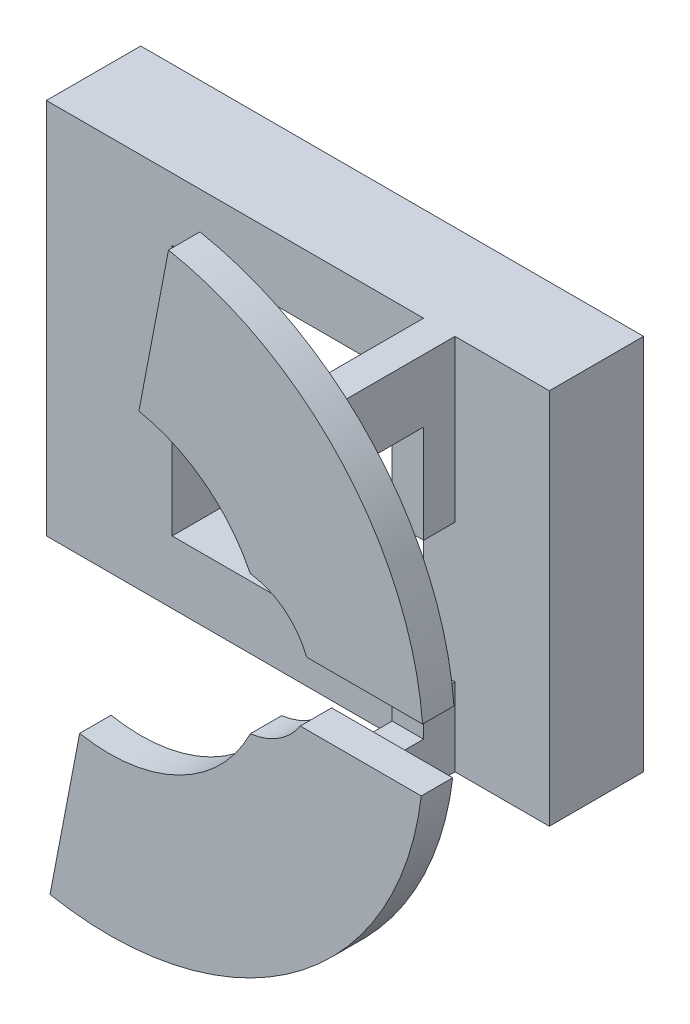
ISO-10303-21;
HEADER;
FILE_DESCRIPTION(('STEP AP214'),'2;1');
FILE_NAME('part.step','',(''),(''),'','','');
FILE_SCHEMA(('AUTOMOTIVE_DESIGN { 1 0 10303 214 1 1 1 1 }'));
ENDSEC;
DATA;
#1=APPLICATION_CONTEXT('core data for automotive mechanical design processes');
#2=APPLICATION_PROTOCOL_DEFINITION('international standard','automotive_design',2000,#1);
#3=PRODUCT_CONTEXT('',#1,'mechanical');
#4=PRODUCT('Part','Part','',(#3));
#5=PRODUCT_RELATED_PRODUCT_CATEGORY('part','',(#4));
#6=PRODUCT_DEFINITION_FORMATION('','',#4);
#7=PRODUCT_DEFINITION_CONTEXT('part definition',#1,'design');
#8=PRODUCT_DEFINITION('design','',#6,#7);
#9=PRODUCT_DEFINITION_SHAPE('','',#8);
#10=(LENGTH_UNIT() NAMED_UNIT(*) SI_UNIT(.MILLI.,.METRE.));
#11=(NAMED_UNIT(*) PLANE_ANGLE_UNIT() SI_UNIT($,.RADIAN.));
#12=(NAMED_UNIT(*) SI_UNIT($,.STERADIAN.) SOLID_ANGLE_UNIT());
#13=UNCERTAINTY_MEASURE_WITH_UNIT(LENGTH_MEASURE(1.E-05),#10,'distance_accuracy_value','');
#14=(GEOMETRIC_REPRESENTATION_CONTEXT(3) GLOBAL_UNCERTAINTY_ASSIGNED_CONTEXT((#13)) GLOBAL_UNIT_ASSIGNED_CONTEXT((#10,
#11,#12)) REPRESENTATION_CONTEXT('',''));
#15=CARTESIAN_POINT('',(0.,0.,0.));
#16=DIRECTION('',(0.,0.,1.));
#17=DIRECTION('',(1.,0.,0.));
#18=AXIS2_PLACEMENT_3D('',#15,#16,#17);
#19=CARTESIAN_POINT('',(0.,0.,20.));
#20=DIRECTION('',(0.,0.,-1.));
#21=DIRECTION('',(-1.,0.,0.));
#22=AXIS2_PLACEMENT_3D('',#19,#20,#21);
#23=PLANE('',#22);
#24=DIRECTION('',(1.,0.,0.));
#25=VECTOR('',#24,1.);
#26=CARTESIAN_POINT('',(20.,20.,20.));
#27=LINE('',#26,#25);
#28=CARTESIAN_POINT('',(20.,20.,20.));
#29=VERTEX_POINT('',#28);
#30=CARTESIAN_POINT('',(25.,20.,20.));
#31=VERTEX_POINT('',#30);
#32=EDGE_CURVE('E55',#29,#31,#27,.T.);
#33=ORIENTED_EDGE('',*,*,#32,.F.);
#34=DIRECTION('',(0.,-1.,0.));
#35=VECTOR('',#34,1.);
#36=CARTESIAN_POINT('',(20.,30.,20.));
#37=LINE('',#36,#35);
#38=CARTESIAN_POINT('',(20.,4.4,20.));
#39=VERTEX_POINT('',#38);
#40=EDGE_CURVE('E342',#29,#39,#37,.T.);
#41=ORIENTED_EDGE('',*,*,#40,.T.);
#42=DIRECTION('',(1.,0.,0.));
#43=VECTOR('',#42,1.);
#44=CARTESIAN_POINT('',(25.,4.4,20.));
#45=LINE('',#44,#43);
#46=CARTESIAN_POINT('',(25.,4.4,20.));
#47=VERTEX_POINT('',#46);
#48=EDGE_CURVE('E345',#39,#47,#45,.T.);
#49=ORIENTED_EDGE('',*,*,#48,.T.);
#50=DIRECTION('',(0.,1.,0.));
#51=VECTOR('',#50,1.);
#52=CARTESIAN_POINT('',(25.,30.,20.));
#53=LINE('',#52,#51);
#54=EDGE_CURVE('E60',#47,#31,#53,.T.);
#55=ORIENTED_EDGE('',*,*,#54,.T.);
#56=EDGE_LOOP('',(#33,#41,#49,#55));
#57=FACE_BOUND('',#56,.T.);
#58=ADVANCED_FACE('F39',(#57),#23,.F.);
#59=CARTESIAN_POINT('',(0.,0.,20.));
#60=DIRECTION('',(0.,0.,1.));
#61=DIRECTION('',(1.,0.,0.));
#62=AXIS2_PLACEMENT_3D('',#59,#60,#61);
#63=PLANE('',#62);
#64=DIRECTION('',(0.,-1.,0.));
#65=VECTOR('',#64,1.);
#66=CARTESIAN_POINT('',(20.,-30.,20.));
#67=LINE('',#66,#65);
#68=CARTESIAN_POINT('',(20.,-17.6,20.));
#69=VERTEX_POINT('',#68);
#70=CARTESIAN_POINT('',(20.,-23.,20.));
#71=VERTEX_POINT('',#70);
#72=EDGE_CURVE('E374',#69,#71,#67,.T.);
#73=ORIENTED_EDGE('',*,*,#72,.T.);
#74=DIRECTION('',(-1.,0.,0.));
#75=VECTOR('',#74,1.);
#76=CARTESIAN_POINT('',(20.,-23.,20.));
#77=LINE('',#76,#75);
#78=CARTESIAN_POINT('',(25.,-23.,20.));
#79=VERTEX_POINT('',#78);
#80=EDGE_CURVE('E321',#79,#71,#77,.T.);
#81=ORIENTED_EDGE('',*,*,#80,.F.);
#82=DIRECTION('',(0.,1.,0.));
#83=VECTOR('',#82,1.);
#84=CARTESIAN_POINT('',(25.,-30.,20.));
#85=LINE('',#84,#83);
#86=CARTESIAN_POINT('',(25.,-17.6,20.));
#87=VERTEX_POINT('',#86);
#88=EDGE_CURVE('E379',#79,#87,#85,.T.);
#89=ORIENTED_EDGE('',*,*,#88,.T.);
#90=DIRECTION('',(-1.,0.,0.));
#91=VECTOR('',#90,1.);
#92=CARTESIAN_POINT('',(25.,-17.6,20.));
#93=LINE('',#92,#91);
#94=EDGE_CURVE('E384',#87,#69,#93,.T.);
#95=ORIENTED_EDGE('',*,*,#94,.T.);
#96=EDGE_LOOP('',(#73,#81,#89,#95));
#97=FACE_BOUND('',#96,.T.);
#98=ADVANCED_FACE('F517',(#97),#63,.T.);
#99=CARTESIAN_POINT('',(0.,0.,15.));
#100=DIRECTION('',(0.,0.,-1.));
#101=DIRECTION('',(-1.,0.,0.));
#102=AXIS2_PLACEMENT_3D('',#99,#100,#101);
#103=PLANE('',#102);
#104=DIRECTION('',(0.,1.,0.));
#105=VECTOR('',#104,1.);
#106=CARTESIAN_POINT('',(25.,30.,15.));
#107=LINE('',#106,#105);
#108=CARTESIAN_POINT('',(25.,4.4,15.));
#109=VERTEX_POINT('',#108);
#110=CARTESIAN_POINT('',(25.,30.,15.));
#111=VERTEX_POINT('',#110);
#112=EDGE_CURVE('E348',#109,#111,#107,.T.);
#113=ORIENTED_EDGE('',*,*,#112,.F.);
#114=DIRECTION('',(1.,0.,0.));
#115=VECTOR('',#114,1.);
#116=CARTESIAN_POINT('',(25.,4.4,15.));
#117=LINE('',#116,#115);
#118=CARTESIAN_POINT('',(20.,4.4,15.));
#119=VERTEX_POINT('',#118);
#120=EDGE_CURVE('E343',#119,#109,#117,.T.);
#121=ORIENTED_EDGE('',*,*,#120,.F.);
#122=DIRECTION('',(0.,1.,0.));
#123=VECTOR('',#122,1.);
#124=CARTESIAN_POINT('',(20.,-20.,15.));
#125=LINE('',#124,#123);
#126=CARTESIAN_POINT('',(20.,-17.6,15.));
#127=VERTEX_POINT('',#126);
#128=EDGE_CURVE('E395',#127,#119,#125,.T.);
#129=ORIENTED_EDGE('',*,*,#128,.F.);
#130=DIRECTION('',(-1.,0.,0.));
#131=VECTOR('',#130,1.);
#132=CARTESIAN_POINT('',(25.,-17.6,15.));
#133=LINE('',#132,#131);
#134=CARTESIAN_POINT('',(25.,-17.6,15.));
#135=VERTEX_POINT('',#134);
#136=EDGE_CURVE('E376',#135,#127,#133,.T.);
#137=ORIENTED_EDGE('',*,*,#136,.F.);
#138=DIRECTION('',(0.,1.,0.));
#139=VECTOR('',#138,1.);
#140=CARTESIAN_POINT('',(25.,-30.,15.));
#141=LINE('',#140,#139);
#142=CARTESIAN_POINT('',(25.,-30.,15.));
#143=VERTEX_POINT('',#142);
#144=EDGE_CURVE('E352',#143,#135,#141,.T.);
#145=ORIENTED_EDGE('',*,*,#144,.F.);
#146=DIRECTION('',(1.,0.,0.));
#147=VECTOR('',#146,1.);
#148=CARTESIAN_POINT('',(40.,-30.,15.));
#149=LINE('',#148,#147);
#150=CARTESIAN_POINT('',(40.,-30.,15.));
#151=VERTEX_POINT('',#150);
#152=EDGE_CURVE('E425',#143,#151,#149,.T.);
#153=ORIENTED_EDGE('',*,*,#152,.T.);
#154=DIRECTION('',(0.,1.,0.));
#155=VECTOR('',#154,1.);
#156=CARTESIAN_POINT('',(40.,-30.,15.));
#157=LINE('',#156,#155);
#158=CARTESIAN_POINT('',(40.,30.,15.));
#159=VERTEX_POINT('',#158);
#160=EDGE_CURVE('E428',#151,#159,#157,.T.);
#161=ORIENTED_EDGE('',*,*,#160,.T.);
#162=DIRECTION('',(-1.,0.,0.));
#163=VECTOR('',#162,1.);
#164=CARTESIAN_POINT('',(40.,30.,15.));
#165=LINE('',#164,#163);
#166=EDGE_CURVE('E419',#159,#111,#165,.T.);
#167=ORIENTED_EDGE('',*,*,#166,.T.);
#168=EDGE_LOOP('',(#113,#121,#129,#137,#145,#153,#161,#167));
#169=FACE_BOUND('',#168,.T.);
#170=ADVANCED_FACE('F471',(#169),#103,.F.);
#171=DIRECTION('',(0.,-1.,0.));
#172=VECTOR('',#171,1.);
#173=CARTESIAN_POINT('',(20.,30.,15.));
#174=LINE('',#173,#172);
#175=CARTESIAN_POINT('',(20.,30.,15.));
#176=VERTEX_POINT('',#175);
#177=CARTESIAN_POINT('',(20.,20.,15.));
#178=VERTEX_POINT('',#177);
#179=EDGE_CURVE('E351',#176,#178,#174,.T.);
#180=ORIENTED_EDGE('',*,*,#179,.F.);
#181=CARTESIAN_POINT('',(-40.,30.,15.));
#182=VERTEX_POINT('',#181);
#183=EDGE_CURVE('E423',#176,#182,#165,.T.);
#184=ORIENTED_EDGE('',*,*,#183,.T.);
#185=DIRECTION('',(0.,-1.,0.));
#186=VECTOR('',#185,1.);
#187=CARTESIAN_POINT('',(-40.,-30.,15.));
#188=LINE('',#187,#186);
#189=CARTESIAN_POINT('',(-40.,-30.,15.));
#190=VERTEX_POINT('',#189);
#191=EDGE_CURVE('E422',#182,#190,#188,.T.);
#192=ORIENTED_EDGE('',*,*,#191,.T.);
#193=CARTESIAN_POINT('',(20.,-30.,15.));
#194=VERTEX_POINT('',#193);
#195=EDGE_CURVE('E426',#190,#194,#149,.T.);
#196=ORIENTED_EDGE('',*,*,#195,.T.);
#197=DIRECTION('',(0.,-1.,0.));
#198=VECTOR('',#197,1.);
#199=CARTESIAN_POINT('',(20.,-30.,15.));
#200=LINE('',#199,#198);
#201=CARTESIAN_POINT('',(20.,-20.,15.));
#202=VERTEX_POINT('',#201);
#203=EDGE_CURVE('E11',#202,#194,#200,.T.);
#204=ORIENTED_EDGE('',*,*,#203,.F.);
#205=DIRECTION('',(1.,0.,0.));
#206=VECTOR('',#205,1.);
#207=CARTESIAN_POINT('',(-20.,-20.,15.));
#208=LINE('',#207,#206);
#209=CARTESIAN_POINT('',(-20.,-20.,15.));
#210=VERTEX_POINT('',#209);
#211=EDGE_CURVE('E392',#210,#202,#208,.T.);
#212=ORIENTED_EDGE('',*,*,#211,.F.);
#213=DIRECTION('',(0.,-1.,0.));
#214=VECTOR('',#213,1.);
#215=CARTESIAN_POINT('',(-20.,-20.,15.));
#216=LINE('',#215,#214);
#217=CARTESIAN_POINT('',(-20.,20.,15.));
#218=VERTEX_POINT('',#217);
#219=EDGE_CURVE('E389',#218,#210,#216,.T.);
#220=ORIENTED_EDGE('',*,*,#219,.F.);
#221=DIRECTION('',(-1.,0.,0.));
#222=VECTOR('',#221,1.);
#223=CARTESIAN_POINT('',(-20.,20.,15.));
#224=LINE('',#223,#222);
#225=EDGE_CURVE('E387',#178,#218,#224,.T.);
#226=ORIENTED_EDGE('',*,*,#225,.F.);
#227=EDGE_LOOP('',(#180,#184,#192,#196,#204,#212,#220,#226));
#228=FACE_BOUND('',#227,.T.);
#229=ADVANCED_FACE('F489',(#228),#103,.F.);
#230=CARTESIAN_POINT('',(0.,0.,0.));
#231=DIRECTION('',(0.,0.,-1.));
#232=DIRECTION('',(-1.,0.,0.));
#233=AXIS2_PLACEMENT_3D('',#230,#231,#232);
#234=PLANE('',#233);
#235=DIRECTION('',(-1.,0.,0.));
#236=VECTOR('',#235,1.);
#237=CARTESIAN_POINT('',(40.,30.,0.));
#238=LINE('',#237,#236);
#239=CARTESIAN_POINT('',(40.,30.,0.));
#240=VERTEX_POINT('',#239);
#241=CARTESIAN_POINT('',(-40.,30.,0.));
#242=VERTEX_POINT('',#241);
#243=EDGE_CURVE('E418',#240,#242,#238,.T.);
#244=ORIENTED_EDGE('',*,*,#243,.F.);
#245=DIRECTION('',(0.,1.,0.));
#246=VECTOR('',#245,1.);
#247=CARTESIAN_POINT('',(40.,-30.,0.));
#248=LINE('',#247,#246);
#249=CARTESIAN_POINT('',(40.,-30.,0.));
#250=VERTEX_POINT('',#249);
#251=EDGE_CURVE('E437',#250,#240,#248,.T.);
#252=ORIENTED_EDGE('',*,*,#251,.F.);
#253=DIRECTION('',(1.,0.,0.));
#254=VECTOR('',#253,1.);
#255=CARTESIAN_POINT('',(40.,-30.,0.));
#256=LINE('',#255,#254);
#257=CARTESIAN_POINT('',(-40.,-30.,0.));
#258=VERTEX_POINT('',#257);
#259=EDGE_CURVE('E435',#258,#250,#256,.T.);
#260=ORIENTED_EDGE('',*,*,#259,.F.);
#261=DIRECTION('',(0.,-1.,0.));
#262=VECTOR('',#261,1.);
#263=CARTESIAN_POINT('',(-40.,-30.,0.));
#264=LINE('',#263,#262);
#265=EDGE_CURVE('E433',#242,#258,#264,.T.);
#266=ORIENTED_EDGE('',*,*,#265,.F.);
#267=EDGE_LOOP('',(#244,#252,#260,#266));
#268=FACE_BOUND('',#267,.T.);
#269=DIRECTION('',(0.,1.,0.));
#270=VECTOR('',#269,1.);
#271=CARTESIAN_POINT('',(20.,-20.,0.));
#272=LINE('',#271,#270);
#273=CARTESIAN_POINT('',(20.,-20.,0.));
#274=VERTEX_POINT('',#273);
#275=CARTESIAN_POINT('',(20.,20.,0.));
#276=VERTEX_POINT('',#275);
#277=EDGE_CURVE('E390',#274,#276,#272,.T.);
#278=ORIENTED_EDGE('',*,*,#277,.T.);
#279=DIRECTION('',(-1.,0.,0.));
#280=VECTOR('',#279,1.);
#281=CARTESIAN_POINT('',(-20.,20.,0.));
#282=LINE('',#281,#280);
#283=CARTESIAN_POINT('',(-20.,20.,0.));
#284=VERTEX_POINT('',#283);
#285=EDGE_CURVE('E363',#276,#284,#282,.T.);
#286=ORIENTED_EDGE('',*,*,#285,.T.);
#287=DIRECTION('',(0.,-1.,0.));
#288=VECTOR('',#287,1.);
#289=CARTESIAN_POINT('',(-20.,-20.,0.));
#290=LINE('',#289,#288);
#291=CARTESIAN_POINT('',(-20.,-20.,0.));
#292=VERTEX_POINT('',#291);
#293=EDGE_CURVE('E401',#284,#292,#290,.T.);
#294=ORIENTED_EDGE('',*,*,#293,.T.);
#295=DIRECTION('',(1.,0.,0.));
#296=VECTOR('',#295,1.);
#297=CARTESIAN_POINT('',(-20.,-20.,0.));
#298=LINE('',#297,#296);
#299=EDGE_CURVE('E404',#292,#274,#298,.T.);
#300=ORIENTED_EDGE('',*,*,#299,.T.);
#301=EDGE_LOOP('',(#278,#286,#294,#300));
#302=FACE_BOUND('',#301,.T.);
#303=ADVANCED_FACE('F461',(#268,#302),#234,.T.);
#304=CARTESIAN_POINT('',(40.,30.,15.));
#305=DIRECTION('',(0.,-1.,0.));
#306=DIRECTION('',(0.,0.,-1.));
#307=AXIS2_PLACEMENT_3D('',#304,#305,#306);
#308=PLANE('',#307);
#309=ORIENTED_EDGE('',*,*,#243,.T.);
#310=DIRECTION('',(0.,0.,-1.));
#311=VECTOR('',#310,1.);
#312=CARTESIAN_POINT('',(-40.,30.,15.));
#313=LINE('',#312,#311);
#314=EDGE_CURVE('E43',#182,#242,#313,.T.);
#315=ORIENTED_EDGE('',*,*,#314,.F.);
#316=ORIENTED_EDGE('',*,*,#183,.F.);
#317=DIRECTION('',(0.,0.,-1.));
#318=VECTOR('',#317,1.);
#319=CARTESIAN_POINT('',(20.,30.,20.));
#320=LINE('',#319,#318);
#321=CARTESIAN_POINT('',(20.,30.,40.));
#322=VERTEX_POINT('',#321);
#323=EDGE_CURVE('E359',#322,#176,#320,.T.);
#324=ORIENTED_EDGE('',*,*,#323,.F.);
#325=DIRECTION('',(-1.,0.,0.));
#326=VECTOR('',#325,1.);
#327=CARTESIAN_POINT('',(20.,30.,40.));
#328=LINE('',#327,#326);
#329=CARTESIAN_POINT('',(25.,30.,40.));
#330=VERTEX_POINT('',#329);
#331=EDGE_CURVE('E312',#330,#322,#328,.T.);
#332=ORIENTED_EDGE('',*,*,#331,.F.);
#333=DIRECTION('',(0.,0.,-1.));
#334=VECTOR('',#333,1.);
#335=CARTESIAN_POINT('',(25.,30.,20.));
#336=LINE('',#335,#334);
#337=EDGE_CURVE('E361',#330,#111,#336,.T.);
#338=ORIENTED_EDGE('',*,*,#337,.T.);
#339=ORIENTED_EDGE('',*,*,#166,.F.);
#340=DIRECTION('',(0.,0.,-1.));
#341=VECTOR('',#340,1.);
#342=CARTESIAN_POINT('',(40.,30.,15.));
#343=LINE('',#342,#341);
#344=EDGE_CURVE('E430',#159,#240,#343,.T.);
#345=ORIENTED_EDGE('',*,*,#344,.T.);
#346=EDGE_LOOP('',(#309,#315,#316,#324,#332,#338,#339,#345));
#347=FACE_BOUND('',#346,.T.);
#348=ADVANCED_FACE('F41',(#347),#308,.F.);
#349=CARTESIAN_POINT('',(-40.,-30.,15.));
#350=DIRECTION('',(1.,0.,0.));
#351=DIRECTION('',(0.,0.,-1.));
#352=AXIS2_PLACEMENT_3D('',#349,#350,#351);
#353=PLANE('',#352);
#354=ORIENTED_EDGE('',*,*,#265,.T.);
#355=DIRECTION('',(0.,0.,-1.));
#356=VECTOR('',#355,1.);
#357=CARTESIAN_POINT('',(-40.,-30.,15.));
#358=LINE('',#357,#356);
#359=EDGE_CURVE('E443',#190,#258,#358,.T.);
#360=ORIENTED_EDGE('',*,*,#359,.F.);
#361=ORIENTED_EDGE('',*,*,#191,.F.);
#362=ORIENTED_EDGE('',*,*,#314,.T.);
#363=EDGE_LOOP('',(#354,#360,#361,#362));
#364=FACE_BOUND('',#363,.T.);
#365=ADVANCED_FACE('F453',(#364),#353,.F.);
#366=CARTESIAN_POINT('',(40.,-30.,15.));
#367=DIRECTION('',(0.,1.,0.));
#368=DIRECTION('',(0.,0.,1.));
#369=AXIS2_PLACEMENT_3D('',#366,#367,#368);
#370=PLANE('',#369);
#371=ORIENTED_EDGE('',*,*,#259,.T.);
#372=DIRECTION('',(0.,0.,-1.));
#373=VECTOR('',#372,1.);
#374=CARTESIAN_POINT('',(40.,-30.,15.));
#375=LINE('',#374,#373);
#376=EDGE_CURVE('E441',#151,#250,#375,.T.);
#377=ORIENTED_EDGE('',*,*,#376,.F.);
#378=ORIENTED_EDGE('',*,*,#152,.F.);
#379=DIRECTION('',(0.,0.,-1.));
#380=VECTOR('',#379,1.);
#381=CARTESIAN_POINT('',(25.,-30.,20.));
#382=LINE('',#381,#380);
#383=CARTESIAN_POINT('',(25.,-30.,40.));
#384=VERTEX_POINT('',#383);
#385=EDGE_CURVE('E372',#384,#143,#382,.T.);
#386=ORIENTED_EDGE('',*,*,#385,.F.);
#387=DIRECTION('',(1.,0.,0.));
#388=VECTOR('',#387,1.);
#389=CARTESIAN_POINT('',(20.,-30.,40.));
#390=LINE('',#389,#388);
#391=CARTESIAN_POINT('',(20.,-30.,40.));
#392=VERTEX_POINT('',#391);
#393=EDGE_CURVE('E325',#392,#384,#390,.T.);
#394=ORIENTED_EDGE('',*,*,#393,.F.);
#395=DIRECTION('',(0.,0.,-1.));
#396=VECTOR('',#395,1.);
#397=CARTESIAN_POINT('',(20.,-30.,20.));
#398=LINE('',#397,#396);
#399=EDGE_CURVE('E369',#392,#194,#398,.T.);
#400=ORIENTED_EDGE('',*,*,#399,.T.);
#401=ORIENTED_EDGE('',*,*,#195,.F.);
#402=ORIENTED_EDGE('',*,*,#359,.T.);
#403=EDGE_LOOP('',(#371,#377,#378,#386,#394,#400,#401,#402));
#404=FACE_BOUND('',#403,.T.);
#405=ADVANCED_FACE('F464',(#404),#370,.F.);
#406=CARTESIAN_POINT('',(40.,-30.,15.));
#407=DIRECTION('',(-1.,0.,0.));
#408=DIRECTION('',(0.,0.,1.));
#409=AXIS2_PLACEMENT_3D('',#406,#407,#408);
#410=PLANE('',#409);
#411=ORIENTED_EDGE('',*,*,#251,.T.);
#412=ORIENTED_EDGE('',*,*,#344,.F.);
#413=ORIENTED_EDGE('',*,*,#160,.F.);
#414=ORIENTED_EDGE('',*,*,#376,.T.);
#415=EDGE_LOOP('',(#411,#412,#413,#414));
#416=FACE_BOUND('',#415,.T.);
#417=ADVANCED_FACE('F468',(#416),#410,.F.);
#418=CARTESIAN_POINT('',(-20.,20.,15.));
#419=DIRECTION('',(0.,-1.,0.));
#420=DIRECTION('',(0.,0.,-1.));
#421=AXIS2_PLACEMENT_3D('',#418,#419,#420);
#422=PLANE('',#421);
#423=ORIENTED_EDGE('',*,*,#285,.F.);
#424=DIRECTION('',(0.,0.,-1.));
#425=VECTOR('',#424,1.);
#426=CARTESIAN_POINT('',(20.,20.,15.));
#427=LINE('',#426,#425);
#428=EDGE_CURVE('E398',#178,#276,#427,.T.);
#429=ORIENTED_EDGE('',*,*,#428,.F.);
#430=ORIENTED_EDGE('',*,*,#225,.T.);
#431=DIRECTION('',(0.,0.,-1.));
#432=VECTOR('',#431,1.);
#433=CARTESIAN_POINT('',(-20.,20.,15.));
#434=LINE('',#433,#432);
#435=EDGE_CURVE('E415',#218,#284,#434,.T.);
#436=ORIENTED_EDGE('',*,*,#435,.T.);
#437=EDGE_LOOP('',(#423,#429,#430,#436));
#438=FACE_BOUND('',#437,.T.);
#439=ADVANCED_FACE('F546',(#438),#422,.T.);
#440=CARTESIAN_POINT('',(-20.,-20.,15.));
#441=DIRECTION('',(1.,0.,0.));
#442=DIRECTION('',(0.,0.,-1.));
#443=AXIS2_PLACEMENT_3D('',#440,#441,#442);
#444=PLANE('',#443);
#445=ORIENTED_EDGE('',*,*,#293,.F.);
#446=ORIENTED_EDGE('',*,*,#435,.F.);
#447=ORIENTED_EDGE('',*,*,#219,.T.);
#448=DIRECTION('',(0.,0.,-1.));
#449=VECTOR('',#448,1.);
#450=CARTESIAN_POINT('',(-20.,-20.,15.));
#451=LINE('',#450,#449);
#452=EDGE_CURVE('E413',#210,#292,#451,.T.);
#453=ORIENTED_EDGE('',*,*,#452,.T.);
#454=EDGE_LOOP('',(#445,#446,#447,#453));
#455=FACE_BOUND('',#454,.T.);
#456=ADVANCED_FACE('F542',(#455),#444,.T.);
#457=CARTESIAN_POINT('',(-20.,-20.,15.));
#458=DIRECTION('',(0.,1.,0.));
#459=DIRECTION('',(0.,0.,1.));
#460=AXIS2_PLACEMENT_3D('',#457,#458,#459);
#461=PLANE('',#460);
#462=ORIENTED_EDGE('',*,*,#299,.F.);
#463=ORIENTED_EDGE('',*,*,#452,.F.);
#464=ORIENTED_EDGE('',*,*,#211,.T.);
#465=DIRECTION('',(0.,0.,-1.));
#466=VECTOR('',#465,1.);
#467=CARTESIAN_POINT('',(20.,-20.,15.));
#468=LINE('',#467,#466);
#469=EDGE_CURVE('E411',#202,#274,#468,.T.);
#470=ORIENTED_EDGE('',*,*,#469,.T.);
#471=EDGE_LOOP('',(#462,#463,#464,#470));
#472=FACE_BOUND('',#471,.T.);
#473=ADVANCED_FACE('F539',(#472),#461,.T.);
#474=CARTESIAN_POINT('',(20.,-20.,15.));
#475=DIRECTION('',(-1.,0.,0.));
#476=DIRECTION('',(0.,0.,1.));
#477=AXIS2_PLACEMENT_3D('',#474,#475,#476);
#478=PLANE('',#477);
#479=ORIENTED_EDGE('',*,*,#277,.F.);
#480=ORIENTED_EDGE('',*,*,#469,.F.);
#481=ORIENTED_EDGE('',*,*,#203,.T.);
#482=ORIENTED_EDGE('',*,*,#399,.F.);
#483=DIRECTION('',(0.,-1.,0.));
#484=VECTOR('',#483,1.);
#485=CARTESIAN_POINT('',(20.,-30.,40.));
#486=LINE('',#485,#484);
#487=CARTESIAN_POINT('',(20.,-23.,40.));
#488=VERTEX_POINT('',#487);
#489=EDGE_CURVE('E322',#488,#392,#486,.T.);
#490=ORIENTED_EDGE('',*,*,#489,.F.);
#491=DIRECTION('',(0.,0.,-1.));
#492=VECTOR('',#491,1.);
#493=CARTESIAN_POINT('',(20.,-23.,40.));
#494=LINE('',#493,#492);
#495=EDGE_CURVE('E334',#488,#71,#494,.T.);
#496=ORIENTED_EDGE('',*,*,#495,.T.);
#497=ORIENTED_EDGE('',*,*,#72,.F.);
#498=DIRECTION('',(0.,0.,-1.));
#499=VECTOR('',#498,1.);
#500=CARTESIAN_POINT('',(20.,-17.6,20.));
#501=LINE('',#500,#499);
#502=EDGE_CURVE('E366',#69,#127,#501,.T.);
#503=ORIENTED_EDGE('',*,*,#502,.T.);
#504=ORIENTED_EDGE('',*,*,#128,.T.);
#505=DIRECTION('',(0.,0.,-1.));
#506=VECTOR('',#505,1.);
#507=CARTESIAN_POINT('',(20.,4.4,20.));
#508=LINE('',#507,#506);
#509=EDGE_CURVE('E357',#39,#119,#508,.T.);
#510=ORIENTED_EDGE('',*,*,#509,.F.);
#511=ORIENTED_EDGE('',*,*,#40,.F.);
#512=DIRECTION('',(0.,0.,-1.));
#513=VECTOR('',#512,1.);
#514=CARTESIAN_POINT('',(20.,20.,40.));
#515=LINE('',#514,#513);
#516=CARTESIAN_POINT('',(20.,20.,40.));
#517=VERTEX_POINT('',#516);
#518=EDGE_CURVE('E318',#517,#29,#515,.T.);
#519=ORIENTED_EDGE('',*,*,#518,.F.);
#520=DIRECTION('',(0.,-1.,0.));
#521=VECTOR('',#520,1.);
#522=CARTESIAN_POINT('',(20.,30.,40.));
#523=LINE('',#522,#521);
#524=EDGE_CURVE('E261',#322,#517,#523,.T.);
#525=ORIENTED_EDGE('',*,*,#524,.F.);
#526=ORIENTED_EDGE('',*,*,#323,.T.);
#527=ORIENTED_EDGE('',*,*,#179,.T.);
#528=ORIENTED_EDGE('',*,*,#428,.T.);
#529=EDGE_LOOP('',(#479,#480,#481,#482,#490,#496,#497,#503,#504,#510,#511,#519,#525,#526,#527,#528));
#530=FACE_BOUND('',#529,.T.);
#531=ADVANCED_FACE('F483',(#530),#478,.T.);
#532=CARTESIAN_POINT('',(25.,-30.,20.));
#533=DIRECTION('',(-1.,0.,0.));
#534=DIRECTION('',(0.,0.,1.));
#535=AXIS2_PLACEMENT_3D('',#532,#533,#534);
#536=PLANE('',#535);
#537=ORIENTED_EDGE('',*,*,#144,.T.);
#538=DIRECTION('',(0.,0.,-1.));
#539=VECTOR('',#538,1.);
#540=CARTESIAN_POINT('',(25.,-17.6,20.));
#541=LINE('',#540,#539);
#542=EDGE_CURVE('E340',#87,#135,#541,.T.);
#543=ORIENTED_EDGE('',*,*,#542,.F.);
#544=ORIENTED_EDGE('',*,*,#88,.F.);
#545=DIRECTION('',(0.,0.,-1.));
#546=VECTOR('',#545,1.);
#547=CARTESIAN_POINT('',(25.,-23.,40.));
#548=LINE('',#547,#546);
#549=CARTESIAN_POINT('',(25.,-23.,40.));
#550=VERTEX_POINT('',#549);
#551=EDGE_CURVE('E338',#550,#79,#548,.T.);
#552=ORIENTED_EDGE('',*,*,#551,.F.);
#553=DIRECTION('',(0.,1.,0.));
#554=VECTOR('',#553,1.);
#555=CARTESIAN_POINT('',(25.,-30.,40.));
#556=LINE('',#555,#554);
#557=EDGE_CURVE('E328',#384,#550,#556,.T.);
#558=ORIENTED_EDGE('',*,*,#557,.F.);
#559=ORIENTED_EDGE('',*,*,#385,.T.);
#560=EDGE_LOOP('',(#537,#543,#544,#552,#558,#559));
#561=FACE_BOUND('',#560,.T.);
#562=ADVANCED_FACE('F475',(#561),#536,.F.);
#563=CARTESIAN_POINT('',(25.,-17.6,20.));
#564=DIRECTION('',(0.,-1.,0.));
#565=DIRECTION('',(0.,0.,-1.));
#566=AXIS2_PLACEMENT_3D('',#563,#564,#565);
#567=PLANE('',#566);
#568=ORIENTED_EDGE('',*,*,#136,.T.);
#569=ORIENTED_EDGE('',*,*,#502,.F.);
#570=ORIENTED_EDGE('',*,*,#94,.F.);
#571=ORIENTED_EDGE('',*,*,#542,.T.);
#572=EDGE_LOOP('',(#568,#569,#570,#571));
#573=FACE_BOUND('',#572,.T.);
#574=ADVANCED_FACE('F531',(#573),#567,.F.);
#575=CARTESIAN_POINT('',(25.,30.,20.));
#576=DIRECTION('',(-1.,0.,0.));
#577=DIRECTION('',(0.,-1.,0.));
#578=AXIS2_PLACEMENT_3D('',#575,#576,#577);
#579=PLANE('',#578);
#580=ORIENTED_EDGE('',*,*,#112,.T.);
#581=ORIENTED_EDGE('',*,*,#337,.F.);
#582=DIRECTION('',(0.,1.,0.));
#583=VECTOR('',#582,1.);
#584=CARTESIAN_POINT('',(25.,30.,40.));
#585=LINE('',#584,#583);
#586=CARTESIAN_POINT('',(25.,20.,40.));
#587=VERTEX_POINT('',#586);
#588=EDGE_CURVE('E309',#587,#330,#585,.T.);
#589=ORIENTED_EDGE('',*,*,#588,.F.);
#590=DIRECTION('',(0.,0.,-1.));
#591=VECTOR('',#590,1.);
#592=CARTESIAN_POINT('',(25.,20.,40.));
#593=LINE('',#592,#591);
#594=EDGE_CURVE('E314',#587,#31,#593,.T.);
#595=ORIENTED_EDGE('',*,*,#594,.T.);
#596=ORIENTED_EDGE('',*,*,#54,.F.);
#597=DIRECTION('',(0.,0.,-1.));
#598=VECTOR('',#597,1.);
#599=CARTESIAN_POINT('',(25.,4.4,20.));
#600=LINE('',#599,#598);
#601=EDGE_CURVE('E347',#47,#109,#600,.T.);
#602=ORIENTED_EDGE('',*,*,#601,.T.);
#603=EDGE_LOOP('',(#580,#581,#589,#595,#596,#602));
#604=FACE_BOUND('',#603,.T.);
#605=ADVANCED_FACE('F499',(#604),#579,.F.);
#606=CARTESIAN_POINT('',(25.,4.4,20.));
#607=DIRECTION('',(0.,1.,0.));
#608=DIRECTION('',(0.,0.,1.));
#609=AXIS2_PLACEMENT_3D('',#606,#607,#608);
#610=PLANE('',#609);
#611=ORIENTED_EDGE('',*,*,#120,.T.);
#612=ORIENTED_EDGE('',*,*,#601,.F.);
#613=ORIENTED_EDGE('',*,*,#48,.F.);
#614=ORIENTED_EDGE('',*,*,#509,.T.);
#615=EDGE_LOOP('',(#611,#612,#613,#614));
#616=FACE_BOUND('',#615,.T.);
#617=ADVANCED_FACE('F512',(#616),#610,.F.);
#618=CARTESIAN_POINT('',(20.,-23.,40.));
#619=DIRECTION('',(0.,-1.,0.));
#620=DIRECTION('',(0.,0.,-1.));
#621=AXIS2_PLACEMENT_3D('',#618,#619,#620);
#622=PLANE('',#621);
#623=ORIENTED_EDGE('',*,*,#80,.T.);
#624=ORIENTED_EDGE('',*,*,#495,.F.);
#625=DIRECTION('',(-1.,0.,0.));
#626=VECTOR('',#625,1.);
#627=CARTESIAN_POINT('',(20.,-23.,40.));
#628=LINE('',#627,#626);
#629=EDGE_CURVE('E331',#550,#488,#628,.T.);
#630=ORIENTED_EDGE('',*,*,#629,.F.);
#631=ORIENTED_EDGE('',*,*,#551,.T.);
#632=EDGE_LOOP('',(#623,#624,#630,#631));
#633=FACE_BOUND('',#632,.T.);
#634=ADVANCED_FACE('F503',(#633),#622,.F.);
#635=CARTESIAN_POINT('',(20.,20.,40.));
#636=DIRECTION('',(0.,1.,0.));
#637=DIRECTION('',(0.,0.,1.));
#638=AXIS2_PLACEMENT_3D('',#635,#636,#637);
#639=PLANE('',#638);
#640=ORIENTED_EDGE('',*,*,#32,.T.);
#641=ORIENTED_EDGE('',*,*,#594,.F.);
#642=DIRECTION('',(1.,0.,0.));
#643=VECTOR('',#642,1.);
#644=CARTESIAN_POINT('',(20.,20.,40.));
#645=LINE('',#644,#643);
#646=EDGE_CURVE('E306',#517,#587,#645,.T.);
#647=ORIENTED_EDGE('',*,*,#646,.F.);
#648=ORIENTED_EDGE('',*,*,#518,.T.);
#649=EDGE_LOOP('',(#640,#641,#647,#648));
#650=FACE_BOUND('',#649,.T.);
#651=ADVANCED_FACE('F501',(#650),#639,.F.);
#652=CARTESIAN_POINT('',(0.,0.,40.));
#653=DIRECTION('',(0.,0.,1.));
#654=DIRECTION('',(1.,0.,0.));
#655=AXIS2_PLACEMENT_3D('',#652,#653,#654);
#656=PLANE('',#655);
#657=CARTESIAN_POINT('',(0.,0.,40.));
#658=DIRECTION('',(0.,0.,-1.));
#659=DIRECTION('',(1.,0.,0.));
#660=AXIS2_PLACEMENT_3D('',#657,#658,#659);
#661=CIRCLE('',#660,25.);
#662=CARTESIAN_POINT('',(4.7124453424895,24.5518402343704,40.));
#663=VERTEX_POINT('',#662);
#664=CARTESIAN_POINT('',(22.4311974759982,11.0381782823423,40.));
#665=VERTEX_POINT('',#664);
#666=EDGE_CURVE('E292',#663,#665,#661,.T.);
#667=ORIENTED_EDGE('',*,*,#666,.F.);
#668=DIRECTION('',(-0.18849781369958,-0.982073609374816,0.));
#669=VECTOR('',#668,1.);
#670=CARTESIAN_POINT('',(4.7124453424895,24.5518402343704,40.));
#671=LINE('',#670,#669);
#672=CARTESIAN_POINT('',(9.42489068497901,49.1036804687408,40.));
#673=VERTEX_POINT('',#672);
#674=EDGE_CURVE('E283',#673,#663,#671,.T.);
#675=ORIENTED_EDGE('',*,*,#674,.F.);
#676=CARTESIAN_POINT('',(0.,0.,40.));
#677=DIRECTION('',(0.,0.,1.));
#678=DIRECTION('',(1.,0.,0.));
#679=AXIS2_PLACEMENT_3D('',#676,#677,#678);
#680=CIRCLE('',#679,50.);
#681=CARTESIAN_POINT('',(49.8397431775085,4.,40.));
#682=VERTEX_POINT('',#681);
#683=EDGE_CURVE('E285',#682,#673,#680,.T.);
#684=ORIENTED_EDGE('',*,*,#683,.F.);
#685=DIRECTION('',(1.,0.,0.));
#686=VECTOR('',#685,1.);
#687=CARTESIAN_POINT('',(49.8397431775085,4.,40.));
#688=LINE('',#687,#686);
#689=CARTESIAN_POINT('',(31.3869969677514,4.,40.));
#690=VERTEX_POINT('',#689);
#691=EDGE_CURVE('E288',#690,#682,#688,.T.);
#692=ORIENTED_EDGE('',*,*,#691,.F.);
#693=CARTESIAN_POINT('',(21.,0.,40.));
#694=DIRECTION('',(0.,0.,-1.));
#695=DIRECTION('',(1.,0.,0.));
#696=AXIS2_PLACEMENT_3D('',#693,#694,#695);
#697=CIRCLE('',#696,11.1305752774992);
#698=EDGE_CURVE('E290',#665,#690,#697,.T.);
#699=ORIENTED_EDGE('',*,*,#698,.F.);
#700=EDGE_LOOP('',(#667,#675,#684,#692,#699));
#701=FACE_BOUND('',#700,.T.);
#702=ORIENTED_EDGE('',*,*,#588,.T.);
#703=ORIENTED_EDGE('',*,*,#331,.T.);
#704=ORIENTED_EDGE('',*,*,#524,.T.);
#705=ORIENTED_EDGE('',*,*,#646,.T.);
#706=EDGE_LOOP('',(#702,#703,#704,#705));
#707=FACE_BOUND('',#706,.T.);
#708=ADVANCED_FACE('F496',(#701,#707),#656,.F.);
#709=CARTESIAN_POINT('',(0.,0.,45.));
#710=DIRECTION('',(0.,0.,-1.));
#711=DIRECTION('',(-1.,0.,0.));
#712=AXIS2_PLACEMENT_3D('',#709,#710,#711);
#713=CYLINDRICAL_SURFACE('',#712,25.);
#714=ORIENTED_EDGE('',*,*,#666,.T.);
#715=DIRECTION('',(0.,0.,-1.));
#716=VECTOR('',#715,1.);
#717=CARTESIAN_POINT('',(22.4311974759982,11.0381782823423,45.));
#718=LINE('',#717,#716);
#719=CARTESIAN_POINT('',(22.4311974759982,11.0381782823423,45.));
#720=VERTEX_POINT('',#719);
#721=EDGE_CURVE('E267',#720,#665,#718,.T.);
#722=ORIENTED_EDGE('',*,*,#721,.F.);
#723=CARTESIAN_POINT('',(0.,0.,45.));
#724=DIRECTION('',(0.,0.,-1.));
#725=DIRECTION('',(1.,0.,0.));
#726=AXIS2_PLACEMENT_3D('',#723,#724,#725);
#727=CIRCLE('',#726,25.);
#728=CARTESIAN_POINT('',(4.7124453424895,24.5518402343704,45.));
#729=VERTEX_POINT('',#728);
#730=EDGE_CURVE('E286',#729,#720,#727,.T.);
#731=ORIENTED_EDGE('',*,*,#730,.F.);
#732=DIRECTION('',(0.,0.,-1.));
#733=VECTOR('',#732,1.);
#734=CARTESIAN_POINT('',(4.7124453424895,24.5518402343704,45.));
#735=LINE('',#734,#733);
#736=EDGE_CURVE('E279',#729,#663,#735,.T.);
#737=ORIENTED_EDGE('',*,*,#736,.T.);
#738=EDGE_LOOP('',(#714,#722,#731,#737));
#739=FACE_BOUND('',#738,.T.);
#740=ADVANCED_FACE('F509',(#739),#713,.F.);
#741=CARTESIAN_POINT('',(21.,0.,45.));
#742=DIRECTION('',(0.,0.,-1.));
#743=DIRECTION('',(-1.,0.,0.));
#744=AXIS2_PLACEMENT_3D('',#741,#742,#743);
#745=CYLINDRICAL_SURFACE('',#744,11.1305752774992);
#746=ORIENTED_EDGE('',*,*,#698,.T.);
#747=DIRECTION('',(0.,0.,-1.));
#748=VECTOR('',#747,1.);
#749=CARTESIAN_POINT('',(31.3869969677514,4.,45.));
#750=LINE('',#749,#748);
#751=CARTESIAN_POINT('',(31.3869969677514,4.,45.));
#752=VERTEX_POINT('',#751);
#753=EDGE_CURVE('E270',#752,#690,#750,.T.);
#754=ORIENTED_EDGE('',*,*,#753,.F.);
#755=CARTESIAN_POINT('',(21.,0.,45.));
#756=DIRECTION('',(0.,0.,-1.));
#757=DIRECTION('',(1.,0.,0.));
#758=AXIS2_PLACEMENT_3D('',#755,#756,#757);
#759=CIRCLE('',#758,11.1305752774992);
#760=EDGE_CURVE('E300',#720,#752,#759,.T.);
#761=ORIENTED_EDGE('',*,*,#760,.F.);
#762=ORIENTED_EDGE('',*,*,#721,.T.);
#763=EDGE_LOOP('',(#746,#754,#761,#762));
#764=FACE_BOUND('',#763,.T.);
#765=ADVANCED_FACE('F613',(#764),#745,.F.);
#766=CARTESIAN_POINT('',(49.8397431775085,4.,45.));
#767=DIRECTION('',(0.,1.,0.));
#768=DIRECTION('',(-1.,0.,0.));
#769=AXIS2_PLACEMENT_3D('',#766,#767,#768);
#770=PLANE('',#769);
#771=ORIENTED_EDGE('',*,*,#691,.T.);
#772=DIRECTION('',(0.,0.,-1.));
#773=VECTOR('',#772,1.);
#774=CARTESIAN_POINT('',(49.8397431775085,4.,45.));
#775=LINE('',#774,#773);
#776=CARTESIAN_POINT('',(49.8397431775085,4.,45.));
#777=VERTEX_POINT('',#776);
#778=EDGE_CURVE('E273',#777,#682,#775,.T.);
#779=ORIENTED_EDGE('',*,*,#778,.F.);
#780=DIRECTION('',(1.,0.,0.));
#781=VECTOR('',#780,1.);
#782=CARTESIAN_POINT('',(49.8397431775085,4.,45.));
#783=LINE('',#782,#781);
#784=EDGE_CURVE('E298',#752,#777,#783,.T.);
#785=ORIENTED_EDGE('',*,*,#784,.F.);
#786=ORIENTED_EDGE('',*,*,#753,.T.);
#787=EDGE_LOOP('',(#771,#779,#785,#786));
#788=FACE_BOUND('',#787,.T.);
#789=ADVANCED_FACE('F622',(#788),#770,.F.);
#790=CARTESIAN_POINT('',(0.,0.,45.));
#791=DIRECTION('',(0.,0.,-1.));
#792=DIRECTION('',(-1.,0.,0.));
#793=AXIS2_PLACEMENT_3D('',#790,#791,#792);
#794=CYLINDRICAL_SURFACE('',#793,50.);
#795=ORIENTED_EDGE('',*,*,#683,.T.);
#796=DIRECTION('',(0.,0.,-1.));
#797=VECTOR('',#796,1.);
#798=CARTESIAN_POINT('',(9.42489068497901,49.1036804687408,45.));
#799=LINE('',#798,#797);
#800=CARTESIAN_POINT('',(9.42489068497901,49.1036804687408,45.));
#801=VERTEX_POINT('',#800);
#802=EDGE_CURVE('E276',#801,#673,#799,.T.);
#803=ORIENTED_EDGE('',*,*,#802,.F.);
#804=CARTESIAN_POINT('',(0.,0.,45.));
#805=DIRECTION('',(0.,0.,1.));
#806=DIRECTION('',(1.,0.,0.));
#807=AXIS2_PLACEMENT_3D('',#804,#805,#806);
#808=CIRCLE('',#807,50.);
#809=EDGE_CURVE('E296',#777,#801,#808,.T.);
#810=ORIENTED_EDGE('',*,*,#809,.F.);
#811=ORIENTED_EDGE('',*,*,#778,.T.);
#812=EDGE_LOOP('',(#795,#803,#810,#811));
#813=FACE_BOUND('',#812,.T.);
#814=ADVANCED_FACE('F631',(#813),#794,.T.);
#815=CARTESIAN_POINT('',(4.7124453424895,24.5518402343704,45.));
#816=DIRECTION('',(0.982073609374816,-0.18849781369958,0.));
#817=DIRECTION('',(0.18849781369958,0.982073609374816,0.));
#818=AXIS2_PLACEMENT_3D('',#815,#816,#817);
#819=PLANE('',#818);
#820=ORIENTED_EDGE('',*,*,#674,.T.);
#821=ORIENTED_EDGE('',*,*,#736,.F.);
#822=DIRECTION('',(-0.18849781369958,-0.982073609374816,0.));
#823=VECTOR('',#822,1.);
#824=CARTESIAN_POINT('',(4.7124453424895,24.5518402343704,45.));
#825=LINE('',#824,#823);
#826=EDGE_CURVE('E282',#801,#729,#825,.T.);
#827=ORIENTED_EDGE('',*,*,#826,.F.);
#828=ORIENTED_EDGE('',*,*,#802,.T.);
#829=EDGE_LOOP('',(#820,#821,#827,#828));
#830=FACE_BOUND('',#829,.T.);
#831=ADVANCED_FACE('F640',(#830),#819,.F.);
#832=CARTESIAN_POINT('',(0.,0.,45.));
#833=DIRECTION('',(0.,0.,1.));
#834=DIRECTION('',(1.,0.,0.));
#835=AXIS2_PLACEMENT_3D('',#832,#833,#834);
#836=PLANE('',#835);
#837=ORIENTED_EDGE('',*,*,#730,.T.);
#838=ORIENTED_EDGE('',*,*,#760,.T.);
#839=ORIENTED_EDGE('',*,*,#784,.T.);
#840=ORIENTED_EDGE('',*,*,#809,.T.);
#841=ORIENTED_EDGE('',*,*,#826,.T.);
#842=EDGE_LOOP('',(#837,#838,#839,#840,#841));
#843=FACE_BOUND('',#842,.T.);
#844=ADVANCED_FACE('F649',(#843),#836,.T.);
#845=CARTESIAN_POINT('',(21.,0.,40.));
#846=DIRECTION('',(0.,0.,1.));
#847=DIRECTION('',(1.,0.,0.));
#848=AXIS2_PLACEMENT_3D('',#845,#846,#847);
#849=PLANE('',#848);
#850=CARTESIAN_POINT('',(21.,0.,40.));
#851=DIRECTION('',(0.,0.,-1.));
#852=DIRECTION('',(1.,0.,0.));
#853=AXIS2_PLACEMENT_3D('',#850,#851,#852);
#854=CIRCLE('',#853,11.1305752774992);
#855=CARTESIAN_POINT('',(30.3749509869693,-6.,40.));
#856=VERTEX_POINT('',#855);
#857=CARTESIAN_POINT('',(22.4311974759982,-11.0381782823423,40.));
#858=VERTEX_POINT('',#857);
#859=EDGE_CURVE('E259',#856,#858,#854,.T.);
#860=ORIENTED_EDGE('',*,*,#859,.F.);
#861=DIRECTION('',(-1.,0.,0.));
#862=VECTOR('',#861,1.);
#863=CARTESIAN_POINT('',(49.6386945839634,-6.,40.));
#864=LINE('',#863,#862);
#865=CARTESIAN_POINT('',(49.6386945839634,-6.00000000000001,40.));
#866=VERTEX_POINT('',#865);
#867=EDGE_CURVE('E255',#866,#856,#864,.T.);
#868=ORIENTED_EDGE('',*,*,#867,.F.);
#869=CARTESIAN_POINT('',(0.,0.,40.));
#870=DIRECTION('',(0.,0.,1.));
#871=DIRECTION('',(1.,0.,0.));
#872=AXIS2_PLACEMENT_3D('',#869,#870,#871);
#873=CIRCLE('',#872,50.);
#874=CARTESIAN_POINT('',(-9.42489068497901,-49.1036804687408,40.));
#875=VERTEX_POINT('',#874);
#876=EDGE_CURVE('E747',#875,#866,#873,.T.);
#877=ORIENTED_EDGE('',*,*,#876,.F.);
#878=DIRECTION('',(-0.18849781369958,-0.982073609374816,0.));
#879=VECTOR('',#878,1.);
#880=CARTESIAN_POINT('',(-9.42489068497901,-49.1036804687408,40.));
#881=LINE('',#880,#879);
#882=CARTESIAN_POINT('',(-4.71244534248951,-24.5518402343704,40.));
#883=VERTEX_POINT('',#882);
#884=EDGE_CURVE('E753',#883,#875,#881,.T.);
#885=ORIENTED_EDGE('',*,*,#884,.F.);
#886=CARTESIAN_POINT('',(0.,0.,40.));
#887=DIRECTION('',(0.,0.,-1.));
#888=DIRECTION('',(1.,0.,0.));
#889=AXIS2_PLACEMENT_3D('',#886,#887,#888);
#890=CIRCLE('',#889,25.);
#891=EDGE_CURVE('E751',#858,#883,#890,.T.);
#892=ORIENTED_EDGE('',*,*,#891,.F.);
#893=EDGE_LOOP('',(#860,#868,#877,#885,#892));
#894=FACE_BOUND('',#893,.T.);
#895=ORIENTED_EDGE('',*,*,#489,.T.);
#896=ORIENTED_EDGE('',*,*,#393,.T.);
#897=ORIENTED_EDGE('',*,*,#557,.T.);
#898=ORIENTED_EDGE('',*,*,#629,.T.);
#899=EDGE_LOOP('',(#895,#896,#897,#898));
#900=FACE_BOUND('',#899,.T.);
#901=ADVANCED_FACE('F480',(#894,#900),#849,.F.);
#902=CARTESIAN_POINT('',(21.,0.,45.));
#903=DIRECTION('',(0.,0.,-1.));
#904=DIRECTION('',(-1.,0.,0.));
#905=AXIS2_PLACEMENT_3D('',#902,#903,#904);
#906=CYLINDRICAL_SURFACE('',#905,11.1305752774992);
#907=ORIENTED_EDGE('',*,*,#859,.T.);
#908=DIRECTION('',(0.,0.,-1.));
#909=VECTOR('',#908,1.);
#910=CARTESIAN_POINT('',(22.4311974759982,-11.0381782823423,45.));
#911=LINE('',#910,#909);
#912=CARTESIAN_POINT('',(22.4311974759982,-11.0381782823423,45.));
#913=VERTEX_POINT('',#912);
#914=EDGE_CURVE('E239',#913,#858,#911,.T.);
#915=ORIENTED_EDGE('',*,*,#914,.F.);
#916=CARTESIAN_POINT('',(21.,0.,45.));
#917=DIRECTION('',(0.,0.,-1.));
#918=DIRECTION('',(1.,0.,0.));
#919=AXIS2_PLACEMENT_3D('',#916,#917,#918);
#920=CIRCLE('',#919,11.1305752774992);
#921=CARTESIAN_POINT('',(30.3749509869693,-6.,45.));
#922=VERTEX_POINT('',#921);
#923=EDGE_CURVE('E246',#922,#913,#920,.T.);
#924=ORIENTED_EDGE('',*,*,#923,.F.);
#925=DIRECTION('',(0.,0.,-1.));
#926=VECTOR('',#925,1.);
#927=CARTESIAN_POINT('',(30.3749509869693,-6.,45.));
#928=LINE('',#927,#926);
#929=EDGE_CURVE('E743',#922,#856,#928,.T.);
#930=ORIENTED_EDGE('',*,*,#929,.T.);
#931=EDGE_LOOP('',(#907,#915,#924,#930));
#932=FACE_BOUND('',#931,.T.);
#933=ADVANCED_FACE('F257',(#932),#906,.F.);
#934=CARTESIAN_POINT('',(0.,0.,45.));
#935=DIRECTION('',(0.,0.,-1.));
#936=DIRECTION('',(-1.,0.,0.));
#937=AXIS2_PLACEMENT_3D('',#934,#935,#936);
#938=CYLINDRICAL_SURFACE('',#937,25.);
#939=ORIENTED_EDGE('',*,*,#891,.T.);
#940=DIRECTION('',(0.,0.,-1.));
#941=VECTOR('',#940,1.);
#942=CARTESIAN_POINT('',(-4.71244534248951,-24.5518402343704,45.));
#943=LINE('',#942,#941);
#944=CARTESIAN_POINT('',(-4.71244534248951,-24.5518402343704,45.));
#945=VERTEX_POINT('',#944);
#946=EDGE_CURVE('E242',#945,#883,#943,.T.);
#947=ORIENTED_EDGE('',*,*,#946,.F.);
#948=CARTESIAN_POINT('',(0.,0.,45.));
#949=DIRECTION('',(0.,0.,-1.));
#950=DIRECTION('',(1.,0.,0.));
#951=AXIS2_PLACEMENT_3D('',#948,#949,#950);
#952=CIRCLE('',#951,25.);
#953=EDGE_CURVE('E235',#913,#945,#952,.T.);
#954=ORIENTED_EDGE('',*,*,#953,.F.);
#955=ORIENTED_EDGE('',*,*,#914,.T.);
#956=EDGE_LOOP('',(#939,#947,#954,#955));
#957=FACE_BOUND('',#956,.T.);
#958=ADVANCED_FACE('F237',(#957),#938,.F.);
#959=CARTESIAN_POINT('',(-9.42489068497901,-49.1036804687408,45.));
#960=DIRECTION('',(0.982073609374816,-0.18849781369958,0.));
#961=DIRECTION('',(0.18849781369958,0.982073609374816,0.));
#962=AXIS2_PLACEMENT_3D('',#959,#960,#961);
#963=PLANE('',#962);
#964=ORIENTED_EDGE('',*,*,#884,.T.);
#965=DIRECTION('',(0.,0.,-1.));
#966=VECTOR('',#965,1.);
#967=CARTESIAN_POINT('',(-9.42489068497901,-49.1036804687408,45.));
#968=LINE('',#967,#966);
#969=CARTESIAN_POINT('',(-9.42489068497901,-49.1036804687408,45.));
#970=VERTEX_POINT('',#969);
#971=EDGE_CURVE('E263',#970,#875,#968,.T.);
#972=ORIENTED_EDGE('',*,*,#971,.F.);
#973=DIRECTION('',(-0.18849781369958,-0.982073609374816,0.));
#974=VECTOR('',#973,1.);
#975=CARTESIAN_POINT('',(-9.42489068497901,-49.1036804687408,45.));
#976=LINE('',#975,#974);
#977=EDGE_CURVE('E245',#945,#970,#976,.T.);
#978=ORIENTED_EDGE('',*,*,#977,.F.);
#979=ORIENTED_EDGE('',*,*,#946,.T.);
#980=EDGE_LOOP('',(#964,#972,#978,#979));
#981=FACE_BOUND('',#980,.T.);
#982=ADVANCED_FACE('F682',(#981),#963,.F.);
#983=CARTESIAN_POINT('',(0.,0.,45.));
#984=DIRECTION('',(0.,0.,-1.));
#985=DIRECTION('',(-1.,0.,0.));
#986=AXIS2_PLACEMENT_3D('',#983,#984,#985);
#987=CYLINDRICAL_SURFACE('',#986,50.);
#988=ORIENTED_EDGE('',*,*,#876,.T.);
#989=DIRECTION('',(0.,0.,-1.));
#990=VECTOR('',#989,1.);
#991=CARTESIAN_POINT('',(49.6386945839634,-6.00000000000001,45.));
#992=LINE('',#991,#990);
#993=CARTESIAN_POINT('',(49.6386945839634,-6.00000000000001,45.));
#994=VERTEX_POINT('',#993);
#995=EDGE_CURVE('E745',#994,#866,#992,.T.);
#996=ORIENTED_EDGE('',*,*,#995,.F.);
#997=CARTESIAN_POINT('',(0.,0.,45.));
#998=DIRECTION('',(0.,0.,1.));
#999=DIRECTION('',(1.,0.,0.));
#1000=AXIS2_PLACEMENT_3D('',#997,#998,#999);
#1001=CIRCLE('',#1000,50.);
#1002=EDGE_CURVE('E763',#970,#994,#1001,.T.);
#1003=ORIENTED_EDGE('',*,*,#1002,.F.);
#1004=ORIENTED_EDGE('',*,*,#971,.T.);
#1005=EDGE_LOOP('',(#988,#996,#1003,#1004));
#1006=FACE_BOUND('',#1005,.T.);
#1007=ADVANCED_FACE('F690',(#1006),#987,.T.);
#1008=CARTESIAN_POINT('',(49.6386945839634,-6.,45.));
#1009=DIRECTION('',(0.,-1.,0.));
#1010=DIRECTION('',(1.,0.,0.));
#1011=AXIS2_PLACEMENT_3D('',#1008,#1009,#1010);
#1012=PLANE('',#1011);
#1013=ORIENTED_EDGE('',*,*,#867,.T.);
#1014=ORIENTED_EDGE('',*,*,#929,.F.);
#1015=DIRECTION('',(-1.,0.,0.));
#1016=VECTOR('',#1015,1.);
#1017=CARTESIAN_POINT('',(49.6386945839634,-6.,45.));
#1018=LINE('',#1017,#1016);
#1019=EDGE_CURVE('E251',#994,#922,#1018,.T.);
#1020=ORIENTED_EDGE('',*,*,#1019,.F.);
#1021=ORIENTED_EDGE('',*,*,#995,.T.);
#1022=EDGE_LOOP('',(#1013,#1014,#1020,#1021));
#1023=FACE_BOUND('',#1022,.T.);
#1024=ADVANCED_FACE('F699',(#1023),#1012,.F.);
#1025=CARTESIAN_POINT('',(21.,0.,45.));
#1026=DIRECTION('',(0.,0.,1.));
#1027=DIRECTION('',(1.,0.,0.));
#1028=AXIS2_PLACEMENT_3D('',#1025,#1026,#1027);
#1029=PLANE('',#1028);
#1030=ORIENTED_EDGE('',*,*,#923,.T.);
#1031=ORIENTED_EDGE('',*,*,#953,.T.);
#1032=ORIENTED_EDGE('',*,*,#977,.T.);
#1033=ORIENTED_EDGE('',*,*,#1002,.T.);
#1034=ORIENTED_EDGE('',*,*,#1019,.T.);
#1035=EDGE_LOOP('',(#1030,#1031,#1032,#1033,#1034));
#1036=FACE_BOUND('',#1035,.T.);
#1037=ADVANCED_FACE('F249',(#1036),#1029,.T.);
#1038=CLOSED_SHELL('',(#58,#98,#170,#229,#303,#348,#365,#405,#417,#439,#456,#473,#531,#562,#574,
#605,#617,#634,#651,#708,#740,#765,#789,#814,#831,#844,#901,#933,#958,#982,#1007,#1024,#1037));
#1039=MANIFOLD_SOLID_BREP('B2',#1038);
#1040=ADVANCED_BREP_SHAPE_REPRESENTATION('',(#18,#1039),#14);
#1041=SHAPE_DEFINITION_REPRESENTATION(#9,#1040);
ENDSEC;
END-ISO-10303-21;
